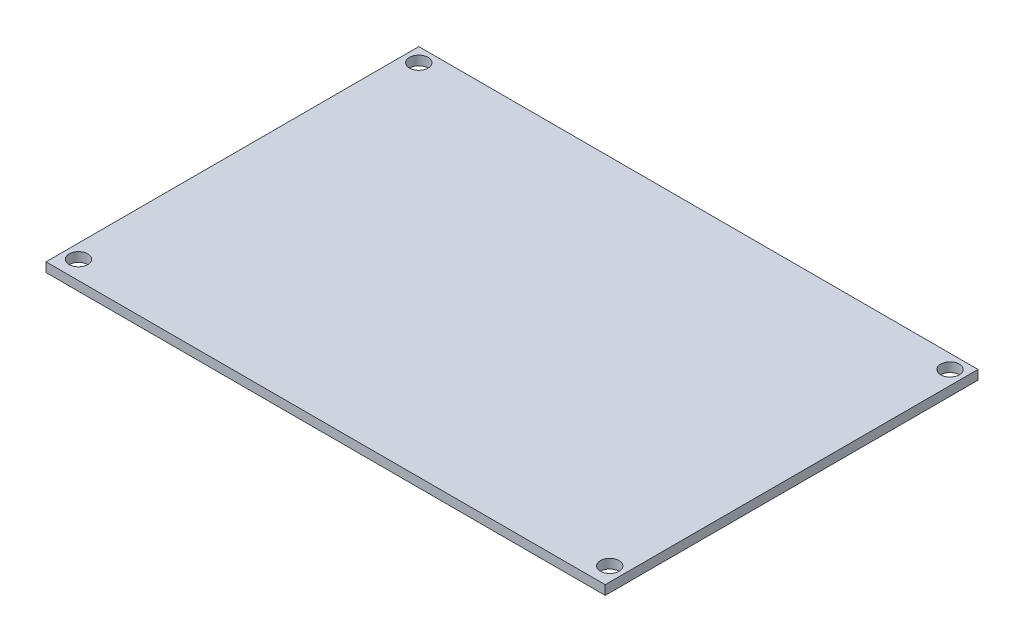
ISO-10303-21;
HEADER;
FILE_DESCRIPTION(('STEP AP214'),'2;1');
FILE_NAME('part.step','',(''),(''),'','','');
FILE_SCHEMA(('AUTOMOTIVE_DESIGN { 1 0 10303 214 1 1 1 1 }'));
ENDSEC;
DATA;
#1=APPLICATION_CONTEXT('core data for automotive mechanical design processes');
#2=APPLICATION_PROTOCOL_DEFINITION('international standard','automotive_design',2000,#1);
#3=PRODUCT_CONTEXT('',#1,'mechanical');
#4=PRODUCT('Part','Part','',(#3));
#5=PRODUCT_RELATED_PRODUCT_CATEGORY('part','',(#4));
#6=PRODUCT_DEFINITION_FORMATION('','',#4);
#7=PRODUCT_DEFINITION_CONTEXT('part definition',#1,'design');
#8=PRODUCT_DEFINITION('design','',#6,#7);
#9=PRODUCT_DEFINITION_SHAPE('','',#8);
#10=(LENGTH_UNIT() NAMED_UNIT(*) SI_UNIT(.MILLI.,.METRE.));
#11=(NAMED_UNIT(*) PLANE_ANGLE_UNIT() SI_UNIT($,.RADIAN.));
#12=(NAMED_UNIT(*) SI_UNIT($,.STERADIAN.) SOLID_ANGLE_UNIT());
#13=UNCERTAINTY_MEASURE_WITH_UNIT(LENGTH_MEASURE(1.E-05),#10,'distance_accuracy_value','');
#14=(GEOMETRIC_REPRESENTATION_CONTEXT(3) GLOBAL_UNCERTAINTY_ASSIGNED_CONTEXT((#13)) GLOBAL_UNIT_ASSIGNED_CONTEXT((#10,
#11,#12)) REPRESENTATION_CONTEXT('',''));
#15=CARTESIAN_POINT('',(0.,0.,0.));
#16=DIRECTION('',(0.,0.,1.));
#17=DIRECTION('',(1.,0.,0.));
#18=AXIS2_PLACEMENT_3D('',#15,#16,#17);
#19=CARTESIAN_POINT('',(60.,2.,40.));
#20=DIRECTION('',(-1.,0.,0.));
#21=DIRECTION('',(0.,0.,1.));
#22=AXIS2_PLACEMENT_3D('',#19,#20,#21);
#23=PLANE('',#22);
#24=DIRECTION('',(0.,0.,-1.));
#25=VECTOR('',#24,1.);
#26=CARTESIAN_POINT('',(60.,0.,40.));
#27=LINE('',#26,#25);
#28=CARTESIAN_POINT('',(60.,0.,40.));
#29=VERTEX_POINT('',#28);
#30=CARTESIAN_POINT('',(60.,0.,-40.));
#31=VERTEX_POINT('',#30);
#32=EDGE_CURVE('E114',#29,#31,#27,.T.);
#33=ORIENTED_EDGE('',*,*,#32,.T.);
#34=DIRECTION('',(0.,-1.,0.));
#35=VECTOR('',#34,1.);
#36=CARTESIAN_POINT('',(60.,2.,-40.));
#37=LINE('',#36,#35);
#38=CARTESIAN_POINT('',(60.,2.,-40.));
#39=VERTEX_POINT('',#38);
#40=EDGE_CURVE('E11',#39,#31,#37,.T.);
#41=ORIENTED_EDGE('',*,*,#40,.F.);
#42=DIRECTION('',(0.,0.,-1.));
#43=VECTOR('',#42,1.);
#44=CARTESIAN_POINT('',(60.,2.,40.));
#45=LINE('',#44,#43);
#46=CARTESIAN_POINT('',(60.,2.,40.));
#47=VERTEX_POINT('',#46);
#48=EDGE_CURVE('E97',#47,#39,#45,.T.);
#49=ORIENTED_EDGE('',*,*,#48,.F.);
#50=DIRECTION('',(0.,-1.,0.));
#51=VECTOR('',#50,1.);
#52=CARTESIAN_POINT('',(60.,2.,40.));
#53=LINE('',#52,#51);
#54=EDGE_CURVE('E110',#47,#29,#53,.T.);
#55=ORIENTED_EDGE('',*,*,#54,.T.);
#56=EDGE_LOOP('',(#33,#41,#49,#55));
#57=FACE_BOUND('',#56,.T.);
#58=ADVANCED_FACE('F43',(#57),#23,.F.);
#59=CARTESIAN_POINT('',(-60.,2.,-40.));
#60=DIRECTION('',(0.,0.,1.));
#61=DIRECTION('',(1.,0.,0.));
#62=AXIS2_PLACEMENT_3D('',#59,#60,#61);
#63=PLANE('',#62);
#64=DIRECTION('',(-1.,0.,0.));
#65=VECTOR('',#64,1.);
#66=CARTESIAN_POINT('',(-60.,0.,-40.));
#67=LINE('',#66,#65);
#68=CARTESIAN_POINT('',(-60.,0.,-40.));
#69=VERTEX_POINT('',#68);
#70=EDGE_CURVE('E102',#31,#69,#67,.T.);
#71=ORIENTED_EDGE('',*,*,#70,.T.);
#72=DIRECTION('',(0.,-1.,0.));
#73=VECTOR('',#72,1.);
#74=CARTESIAN_POINT('',(-60.,2.,-40.));
#75=LINE('',#74,#73);
#76=CARTESIAN_POINT('',(-60.,2.,-40.));
#77=VERTEX_POINT('',#76);
#78=EDGE_CURVE('E53',#77,#69,#75,.T.);
#79=ORIENTED_EDGE('',*,*,#78,.F.);
#80=DIRECTION('',(-1.,0.,0.));
#81=VECTOR('',#80,1.);
#82=CARTESIAN_POINT('',(-60.,2.,-40.));
#83=LINE('',#82,#81);
#84=EDGE_CURVE('E92',#39,#77,#83,.T.);
#85=ORIENTED_EDGE('',*,*,#84,.F.);
#86=ORIENTED_EDGE('',*,*,#40,.T.);
#87=EDGE_LOOP('',(#71,#79,#85,#86));
#88=FACE_BOUND('',#87,.T.);
#89=ADVANCED_FACE('F101',(#88),#63,.F.);
#90=CARTESIAN_POINT('',(-60.,2.,40.));
#91=DIRECTION('',(1.,0.,0.));
#92=DIRECTION('',(0.,0.,-1.));
#93=AXIS2_PLACEMENT_3D('',#90,#91,#92);
#94=PLANE('',#93);
#95=DIRECTION('',(0.,0.,1.));
#96=VECTOR('',#95,1.);
#97=CARTESIAN_POINT('',(-60.,0.,40.));
#98=LINE('',#97,#96);
#99=CARTESIAN_POINT('',(-60.,0.,40.));
#100=VERTEX_POINT('',#99);
#101=EDGE_CURVE('E79',#69,#100,#98,.T.);
#102=ORIENTED_EDGE('',*,*,#101,.T.);
#103=DIRECTION('',(0.,-1.,0.));
#104=VECTOR('',#103,1.);
#105=CARTESIAN_POINT('',(-60.,2.,40.));
#106=LINE('',#105,#104);
#107=CARTESIAN_POINT('',(-60.,2.,40.));
#108=VERTEX_POINT('',#107);
#109=EDGE_CURVE('E104',#108,#100,#106,.T.);
#110=ORIENTED_EDGE('',*,*,#109,.F.);
#111=DIRECTION('',(0.,0.,1.));
#112=VECTOR('',#111,1.);
#113=CARTESIAN_POINT('',(-60.,2.,40.));
#114=LINE('',#113,#112);
#115=EDGE_CURVE('E95',#77,#108,#114,.T.);
#116=ORIENTED_EDGE('',*,*,#115,.F.);
#117=ORIENTED_EDGE('',*,*,#78,.T.);
#118=EDGE_LOOP('',(#102,#110,#116,#117));
#119=FACE_BOUND('',#118,.T.);
#120=ADVANCED_FACE('F106',(#119),#94,.F.);
#121=CARTESIAN_POINT('',(-60.,2.,40.));
#122=DIRECTION('',(0.,0.,-1.));
#123=DIRECTION('',(-1.,0.,0.));
#124=AXIS2_PLACEMENT_3D('',#121,#122,#123);
#125=PLANE('',#124);
#126=DIRECTION('',(1.,0.,0.));
#127=VECTOR('',#126,1.);
#128=CARTESIAN_POINT('',(-60.,0.,40.));
#129=LINE('',#128,#127);
#130=EDGE_CURVE('E85',#100,#29,#129,.T.);
#131=ORIENTED_EDGE('',*,*,#130,.T.);
#132=ORIENTED_EDGE('',*,*,#54,.F.);
#133=DIRECTION('',(1.,0.,0.));
#134=VECTOR('',#133,1.);
#135=CARTESIAN_POINT('',(-60.,2.,40.));
#136=LINE('',#135,#134);
#137=EDGE_CURVE('E62',#108,#47,#136,.T.);
#138=ORIENTED_EDGE('',*,*,#137,.F.);
#139=ORIENTED_EDGE('',*,*,#109,.T.);
#140=EDGE_LOOP('',(#131,#132,#138,#139));
#141=FACE_BOUND('',#140,.T.);
#142=ADVANCED_FACE('F172',(#141),#125,.F.);
#143=CARTESIAN_POINT('',(0.,2.,0.));
#144=DIRECTION('',(0.,-1.,0.));
#145=DIRECTION('',(0.,0.,-1.));
#146=AXIS2_PLACEMENT_3D('',#143,#144,#145);
#147=PLANE('',#146);
#148=CARTESIAN_POINT('',(-57.0000000000014,2.,36.0287680631538));
#149=DIRECTION('',(0.,-1.,0.));
#150=DIRECTION('',(0.,0.,-1.));
#151=AXIS2_PLACEMENT_3D('',#148,#149,#150);
#152=CIRCLE('',#151,1.99999999999996);
#153=CARTESIAN_POINT('',(-57.0000000000014,2.,34.0287680631538));
#154=VERTEX_POINT('',#153);
#155=EDGE_CURVE('E118',#154,#154,#152,.F.);
#156=ORIENTED_EDGE('',*,*,#155,.F.);
#157=EDGE_LOOP('',(#156));
#158=FACE_BOUND('',#157,.T.);
#159=CARTESIAN_POINT('',(57.0000000000013,2.,36.0287680631538));
#160=DIRECTION('',(0.,-1.,0.));
#161=DIRECTION('',(0.,0.,-1.));
#162=AXIS2_PLACEMENT_3D('',#159,#160,#161);
#163=CIRCLE('',#162,1.99999999999994);
#164=CARTESIAN_POINT('',(57.0000000000013,2.,34.0287680631539));
#165=VERTEX_POINT('',#164);
#166=EDGE_CURVE('E141',#165,#165,#163,.F.);
#167=ORIENTED_EDGE('',*,*,#166,.F.);
#168=EDGE_LOOP('',(#167));
#169=FACE_BOUND('',#168,.T.);
#170=CARTESIAN_POINT('',(57.0000000000013,2.,-37.0000000000048));
#171=DIRECTION('',(0.,-1.,0.));
#172=DIRECTION('',(0.,0.,-1.));
#173=AXIS2_PLACEMENT_3D('',#170,#171,#172);
#174=CIRCLE('',#173,1.9999999999999);
#175=CARTESIAN_POINT('',(57.0000000000013,2.,-39.0000000000047));
#176=VERTEX_POINT('',#175);
#177=EDGE_CURVE('E137',#176,#176,#174,.F.);
#178=ORIENTED_EDGE('',*,*,#177,.F.);
#179=EDGE_LOOP('',(#178));
#180=FACE_BOUND('',#179,.T.);
#181=CARTESIAN_POINT('',(-57.0000000000014,2.,-37.0000000000048));
#182=DIRECTION('',(0.,-1.,0.));
#183=DIRECTION('',(0.,0.,-1.));
#184=AXIS2_PLACEMENT_3D('',#181,#182,#183);
#185=CIRCLE('',#184,1.99999999999992);
#186=CARTESIAN_POINT('',(-57.0000000000014,2.,-39.0000000000047));
#187=VERTEX_POINT('',#186);
#188=EDGE_CURVE('E133',#187,#187,#185,.F.);
#189=ORIENTED_EDGE('',*,*,#188,.F.);
#190=EDGE_LOOP('',(#189));
#191=FACE_BOUND('',#190,.T.);
#192=ORIENTED_EDGE('',*,*,#48,.T.);
#193=ORIENTED_EDGE('',*,*,#84,.T.);
#194=ORIENTED_EDGE('',*,*,#115,.T.);
#195=ORIENTED_EDGE('',*,*,#137,.T.);
#196=EDGE_LOOP('',(#192,#193,#194,#195));
#197=FACE_BOUND('',#196,.T.);
#198=ADVANCED_FACE('F93',(#158,#169,#180,#191,#197),#147,.F.);
#199=CARTESIAN_POINT('',(0.,0.,0.));
#200=DIRECTION('',(0.,-1.,0.));
#201=DIRECTION('',(0.,0.,-1.));
#202=AXIS2_PLACEMENT_3D('',#199,#200,#201);
#203=PLANE('',#202);
#204=CARTESIAN_POINT('',(-57.0000000000014,0.,36.0287680631538));
#205=DIRECTION('',(0.,-1.,0.));
#206=DIRECTION('',(0.,0.,-1.));
#207=AXIS2_PLACEMENT_3D('',#204,#205,#206);
#208=CIRCLE('',#207,1.99999999999996);
#209=CARTESIAN_POINT('',(-57.0000000000014,0.,34.0287680631538));
#210=VERTEX_POINT('',#209);
#211=EDGE_CURVE('E46',#210,#210,#208,.F.);
#212=ORIENTED_EDGE('',*,*,#211,.T.);
#213=EDGE_LOOP('',(#212));
#214=FACE_BOUND('',#213,.T.);
#215=CARTESIAN_POINT('',(57.0000000000013,0.,36.0287680631538));
#216=DIRECTION('',(0.,-1.,0.));
#217=DIRECTION('',(0.,0.,-1.));
#218=AXIS2_PLACEMENT_3D('',#215,#216,#217);
#219=CIRCLE('',#218,1.99999999999994);
#220=CARTESIAN_POINT('',(57.0000000000013,0.,34.0287680631539));
#221=VERTEX_POINT('',#220);
#222=EDGE_CURVE('E138',#221,#221,#219,.F.);
#223=ORIENTED_EDGE('',*,*,#222,.T.);
#224=EDGE_LOOP('',(#223));
#225=FACE_BOUND('',#224,.T.);
#226=CARTESIAN_POINT('',(57.0000000000013,0.,-37.0000000000048));
#227=DIRECTION('',(0.,-1.,0.));
#228=DIRECTION('',(0.,0.,-1.));
#229=AXIS2_PLACEMENT_3D('',#226,#227,#228);
#230=CIRCLE('',#229,1.9999999999999);
#231=CARTESIAN_POINT('',(57.0000000000013,0.,-39.0000000000047));
#232=VERTEX_POINT('',#231);
#233=EDGE_CURVE('E134',#232,#232,#230,.F.);
#234=ORIENTED_EDGE('',*,*,#233,.T.);
#235=EDGE_LOOP('',(#234));
#236=FACE_BOUND('',#235,.T.);
#237=CARTESIAN_POINT('',(-57.0000000000014,0.,-37.0000000000048));
#238=DIRECTION('',(0.,-1.,0.));
#239=DIRECTION('',(0.,0.,-1.));
#240=AXIS2_PLACEMENT_3D('',#237,#238,#239);
#241=CIRCLE('',#240,1.99999999999992);
#242=CARTESIAN_POINT('',(-57.0000000000014,0.,-39.0000000000047));
#243=VERTEX_POINT('',#242);
#244=EDGE_CURVE('E129',#243,#243,#241,.F.);
#245=ORIENTED_EDGE('',*,*,#244,.T.);
#246=EDGE_LOOP('',(#245));
#247=FACE_BOUND('',#246,.T.);
#248=ORIENTED_EDGE('',*,*,#32,.F.);
#249=ORIENTED_EDGE('',*,*,#130,.F.);
#250=ORIENTED_EDGE('',*,*,#101,.F.);
#251=ORIENTED_EDGE('',*,*,#70,.F.);
#252=EDGE_LOOP('',(#248,#249,#250,#251));
#253=FACE_BOUND('',#252,.T.);
#254=ADVANCED_FACE('F161',(#214,#225,#236,#247,#253),#203,.T.);
#255=CARTESIAN_POINT('',(-57.0000000000014,12.,-37.0000000000048));
#256=DIRECTION('',(0.,-1.,0.));
#257=DIRECTION('',(0.,0.,-1.));
#258=AXIS2_PLACEMENT_3D('',#255,#256,#257);
#259=CYLINDRICAL_SURFACE('',#258,1.99999999999992);
#260=ORIENTED_EDGE('',*,*,#244,.F.);
#261=EDGE_LOOP('',(#260));
#262=FACE_BOUND('',#261,.T.);
#263=ORIENTED_EDGE('',*,*,#188,.T.);
#264=EDGE_LOOP('',(#263));
#265=FACE_BOUND('',#264,.T.);
#266=ADVANCED_FACE('F181',(#262,#265),#259,.F.);
#267=CARTESIAN_POINT('',(57.0000000000013,12.,-37.0000000000048));
#268=DIRECTION('',(0.,-1.,0.));
#269=DIRECTION('',(0.,0.,-1.));
#270=AXIS2_PLACEMENT_3D('',#267,#268,#269);
#271=CYLINDRICAL_SURFACE('',#270,1.9999999999999);
#272=ORIENTED_EDGE('',*,*,#233,.F.);
#273=EDGE_LOOP('',(#272));
#274=FACE_BOUND('',#273,.T.);
#275=ORIENTED_EDGE('',*,*,#177,.T.);
#276=EDGE_LOOP('',(#275));
#277=FACE_BOUND('',#276,.T.);
#278=ADVANCED_FACE('F183',(#274,#277),#271,.F.);
#279=CARTESIAN_POINT('',(57.0000000000013,12.,36.0287680631538));
#280=DIRECTION('',(0.,-1.,0.));
#281=DIRECTION('',(0.,0.,-1.));
#282=AXIS2_PLACEMENT_3D('',#279,#280,#281);
#283=CYLINDRICAL_SURFACE('',#282,1.99999999999994);
#284=ORIENTED_EDGE('',*,*,#222,.F.);
#285=EDGE_LOOP('',(#284));
#286=FACE_BOUND('',#285,.T.);
#287=ORIENTED_EDGE('',*,*,#166,.T.);
#288=EDGE_LOOP('',(#287));
#289=FACE_BOUND('',#288,.T.);
#290=ADVANCED_FACE('F166',(#286,#289),#283,.F.);
#291=CARTESIAN_POINT('',(-57.0000000000014,12.,36.0287680631538));
#292=DIRECTION('',(0.,-1.,0.));
#293=DIRECTION('',(0.,0.,-1.));
#294=AXIS2_PLACEMENT_3D('',#291,#292,#293);
#295=CYLINDRICAL_SURFACE('',#294,1.99999999999996);
#296=ORIENTED_EDGE('',*,*,#211,.F.);
#297=EDGE_LOOP('',(#296));
#298=FACE_BOUND('',#297,.T.);
#299=ORIENTED_EDGE('',*,*,#155,.T.);
#300=EDGE_LOOP('',(#299));
#301=FACE_BOUND('',#300,.T.);
#302=ADVANCED_FACE('F163',(#298,#301),#295,.F.);
#303=CLOSED_SHELL('',(#58,#89,#120,#142,#198,#254,#266,#278,#290,#302));
#304=MANIFOLD_SOLID_BREP('B2',#303);
#305=ADVANCED_BREP_SHAPE_REPRESENTATION('',(#18,#304),#14);
#306=SHAPE_DEFINITION_REPRESENTATION(#9,#305);
ENDSEC;
END-ISO-10303-21;
